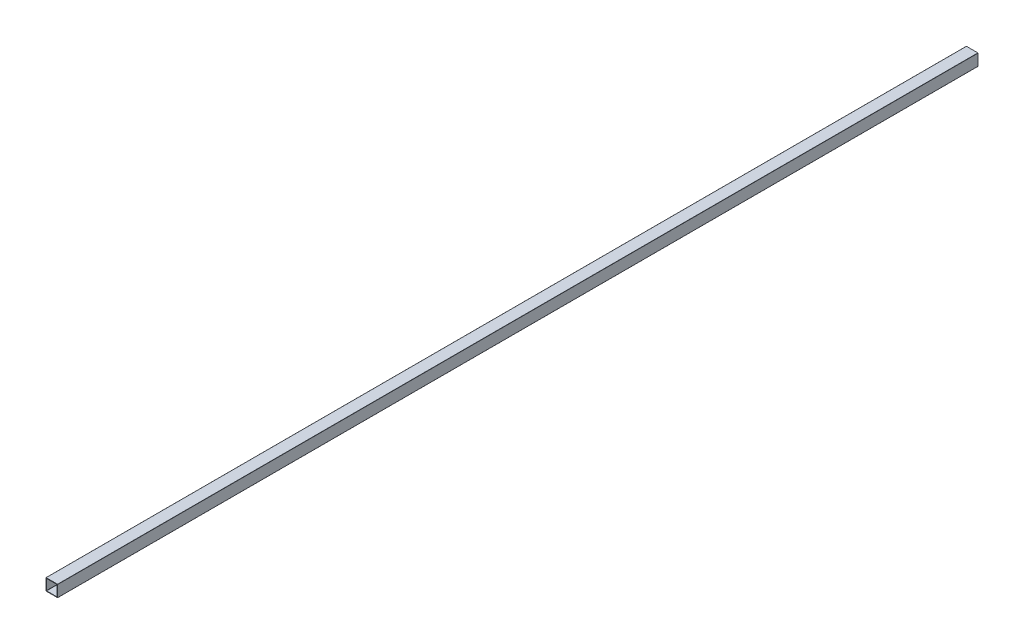
ISO-10303-21;
HEADER;
FILE_DESCRIPTION(('STEP AP214'),'2;1');
FILE_NAME('part.step','',(''),(''),'','','');
FILE_SCHEMA(('AUTOMOTIVE_DESIGN { 1 0 10303 214 1 1 1 1 }'));
ENDSEC;
DATA;
#1=APPLICATION_CONTEXT('core data for automotive mechanical design processes');
#2=APPLICATION_PROTOCOL_DEFINITION('international standard','automotive_design',2000,#1);
#3=PRODUCT_CONTEXT('',#1,'mechanical');
#4=PRODUCT('Part','Part','',(#3));
#5=PRODUCT_RELATED_PRODUCT_CATEGORY('part','',(#4));
#6=PRODUCT_DEFINITION_FORMATION('','',#4);
#7=PRODUCT_DEFINITION_CONTEXT('part definition',#1,'design');
#8=PRODUCT_DEFINITION('design','',#6,#7);
#9=PRODUCT_DEFINITION_SHAPE('','',#8);
#10=(LENGTH_UNIT() NAMED_UNIT(*) SI_UNIT(.MILLI.,.METRE.));
#11=(NAMED_UNIT(*) PLANE_ANGLE_UNIT() SI_UNIT($,.RADIAN.));
#12=(NAMED_UNIT(*) SI_UNIT($,.STERADIAN.) SOLID_ANGLE_UNIT());
#13=UNCERTAINTY_MEASURE_WITH_UNIT(LENGTH_MEASURE(1.E-05),#10,'distance_accuracy_value','');
#14=(GEOMETRIC_REPRESENTATION_CONTEXT(3) GLOBAL_UNCERTAINTY_ASSIGNED_CONTEXT((#13)) GLOBAL_UNIT_ASSIGNED_CONTEXT((#10,
#11,#12)) REPRESENTATION_CONTEXT('',''));
#15=CARTESIAN_POINT('',(0.,0.,0.));
#16=DIRECTION('',(0.,0.,1.));
#17=DIRECTION('',(1.,0.,0.));
#18=AXIS2_PLACEMENT_3D('',#15,#16,#17);
#19=CARTESIAN_POINT('',(38.1,-38.1,-6000.));
#20=DIRECTION('',(1.,0.,0.));
#21=DIRECTION('',(0.,0.,-1.));
#22=AXIS2_PLACEMENT_3D('',#19,#20,#21);
#23=PLANE('',#22);
#24=DIRECTION('',(0.,1.,0.));
#25=VECTOR('',#24,1.);
#26=CARTESIAN_POINT('',(38.1,-38.1,0.));
#27=LINE('',#26,#25);
#28=CARTESIAN_POINT('',(38.1,-37.1,0.));
#29=VERTEX_POINT('',#28);
#30=CARTESIAN_POINT('',(38.1,37.1,0.));
#31=VERTEX_POINT('',#30);
#32=EDGE_CURVE('E197',#29,#31,#27,.T.);
#33=ORIENTED_EDGE('',*,*,#32,.F.);
#34=DIRECTION('',(0.,0.,1.));
#35=VECTOR('',#34,1.);
#36=CARTESIAN_POINT('',(38.1,-37.1,-6000.));
#37=LINE('',#36,#35);
#38=CARTESIAN_POINT('',(38.1,-37.1,-6000.));
#39=VERTEX_POINT('',#38);
#40=EDGE_CURVE('E158',#29,#39,#37,.F.);
#41=ORIENTED_EDGE('',*,*,#40,.T.);
#42=DIRECTION('',(0.,1.,0.));
#43=VECTOR('',#42,1.);
#44=CARTESIAN_POINT('',(38.1,-38.1,-6000.));
#45=LINE('',#44,#43);
#46=CARTESIAN_POINT('',(38.1,37.1,-6000.));
#47=VERTEX_POINT('',#46);
#48=EDGE_CURVE('E185',#39,#47,#45,.T.);
#49=ORIENTED_EDGE('',*,*,#48,.T.);
#50=DIRECTION('',(0.,0.,1.));
#51=VECTOR('',#50,1.);
#52=CARTESIAN_POINT('',(38.1,37.1,-6000.));
#53=LINE('',#52,#51);
#54=EDGE_CURVE('E251',#47,#31,#53,.T.);
#55=ORIENTED_EDGE('',*,*,#54,.T.);
#56=EDGE_LOOP('',(#33,#41,#49,#55));
#57=FACE_BOUND('',#56,.T.);
#58=ADVANCED_FACE('F33',(#57),#23,.T.);
#59=CARTESIAN_POINT('',(-38.1,-38.1,-6000.));
#60=DIRECTION('',(0.,-1.,0.));
#61=DIRECTION('',(0.,0.,-1.));
#62=AXIS2_PLACEMENT_3D('',#59,#60,#61);
#63=PLANE('',#62);
#64=DIRECTION('',(1.,0.,0.));
#65=VECTOR('',#64,1.);
#66=CARTESIAN_POINT('',(-38.1,-38.1,0.));
#67=LINE('',#66,#65);
#68=CARTESIAN_POINT('',(-37.1,-38.1,0.));
#69=VERTEX_POINT('',#68);
#70=CARTESIAN_POINT('',(37.1,-38.1,0.));
#71=VERTEX_POINT('',#70);
#72=EDGE_CURVE('E189',#69,#71,#67,.T.);
#73=ORIENTED_EDGE('',*,*,#72,.F.);
#74=DIRECTION('',(0.,0.,1.));
#75=VECTOR('',#74,1.);
#76=CARTESIAN_POINT('',(-37.1,-38.1,-6000.));
#77=LINE('',#76,#75);
#78=CARTESIAN_POINT('',(-37.1,-38.1,-6000.));
#79=VERTEX_POINT('',#78);
#80=EDGE_CURVE('E238',#69,#79,#77,.F.);
#81=ORIENTED_EDGE('',*,*,#80,.T.);
#82=DIRECTION('',(1.,0.,0.));
#83=VECTOR('',#82,1.);
#84=CARTESIAN_POINT('',(-38.1,-38.1,-6000.));
#85=LINE('',#84,#83);
#86=CARTESIAN_POINT('',(37.1,-38.1,-6000.));
#87=VERTEX_POINT('',#86);
#88=EDGE_CURVE('E194',#79,#87,#85,.T.);
#89=ORIENTED_EDGE('',*,*,#88,.T.);
#90=DIRECTION('',(0.,0.,1.));
#91=VECTOR('',#90,1.);
#92=CARTESIAN_POINT('',(37.1,-38.1,-6000.));
#93=LINE('',#92,#91);
#94=EDGE_CURVE('E235',#87,#71,#93,.T.);
#95=ORIENTED_EDGE('',*,*,#94,.T.);
#96=EDGE_LOOP('',(#73,#81,#89,#95));
#97=FACE_BOUND('',#96,.T.);
#98=ADVANCED_FACE('F305',(#97),#63,.T.);
#99=CARTESIAN_POINT('',(-38.1,-38.1,-6000.));
#100=DIRECTION('',(-1.,0.,0.));
#101=DIRECTION('',(0.,0.,1.));
#102=AXIS2_PLACEMENT_3D('',#99,#100,#101);
#103=PLANE('',#102);
#104=DIRECTION('',(0.,-1.,0.));
#105=VECTOR('',#104,1.);
#106=CARTESIAN_POINT('',(-38.1,-38.1,-6000.));
#107=LINE('',#106,#105);
#108=CARTESIAN_POINT('',(-38.1,37.1,-6000.));
#109=VERTEX_POINT('',#108);
#110=CARTESIAN_POINT('',(-38.1,-37.1,-6000.));
#111=VERTEX_POINT('',#110);
#112=EDGE_CURVE('E191',#109,#111,#107,.T.);
#113=ORIENTED_EDGE('',*,*,#112,.T.);
#114=DIRECTION('',(0.,0.,1.));
#115=VECTOR('',#114,1.);
#116=CARTESIAN_POINT('',(-38.1,-37.1,-6000.));
#117=LINE('',#116,#115);
#118=CARTESIAN_POINT('',(-38.1,-37.1,0.));
#119=VERTEX_POINT('',#118);
#120=EDGE_CURVE('E224',#111,#119,#117,.T.);
#121=ORIENTED_EDGE('',*,*,#120,.T.);
#122=DIRECTION('',(0.,-1.,0.));
#123=VECTOR('',#122,1.);
#124=CARTESIAN_POINT('',(-38.1,-38.1,0.));
#125=LINE('',#124,#123);
#126=CARTESIAN_POINT('',(-38.1,37.1,0.));
#127=VERTEX_POINT('',#126);
#128=EDGE_CURVE('E203',#127,#119,#125,.T.);
#129=ORIENTED_EDGE('',*,*,#128,.F.);
#130=DIRECTION('',(0.,0.,1.));
#131=VECTOR('',#130,1.);
#132=CARTESIAN_POINT('',(-38.1,37.1,-6000.));
#133=LINE('',#132,#131);
#134=EDGE_CURVE('E222',#127,#109,#133,.F.);
#135=ORIENTED_EDGE('',*,*,#134,.T.);
#136=EDGE_LOOP('',(#113,#121,#129,#135));
#137=FACE_BOUND('',#136,.T.);
#138=ADVANCED_FACE('F311',(#137),#103,.T.);
#139=CARTESIAN_POINT('',(-38.1,38.1,-6000.));
#140=DIRECTION('',(0.,1.,0.));
#141=DIRECTION('',(0.,0.,1.));
#142=AXIS2_PLACEMENT_3D('',#139,#140,#141);
#143=PLANE('',#142);
#144=DIRECTION('',(-1.,0.,0.));
#145=VECTOR('',#144,1.);
#146=CARTESIAN_POINT('',(-38.1,38.1,-6000.));
#147=LINE('',#146,#145);
#148=CARTESIAN_POINT('',(37.1,38.1,-6000.));
#149=VERTEX_POINT('',#148);
#150=CARTESIAN_POINT('',(-37.1,38.1,-6000.));
#151=VERTEX_POINT('',#150);
#152=EDGE_CURVE('E188',#149,#151,#147,.T.);
#153=ORIENTED_EDGE('',*,*,#152,.T.);
#154=DIRECTION('',(0.,0.,1.));
#155=VECTOR('',#154,1.);
#156=CARTESIAN_POINT('',(-37.1,38.1,-6000.));
#157=LINE('',#156,#155);
#158=CARTESIAN_POINT('',(-37.1,38.1,0.));
#159=VERTEX_POINT('',#158);
#160=EDGE_CURVE('E248',#151,#159,#157,.T.);
#161=ORIENTED_EDGE('',*,*,#160,.T.);
#162=DIRECTION('',(-1.,0.,0.));
#163=VECTOR('',#162,1.);
#164=CARTESIAN_POINT('',(-38.1,38.1,0.));
#165=LINE('',#164,#163);
#166=CARTESIAN_POINT('',(37.1,38.1,0.));
#167=VERTEX_POINT('',#166);
#168=EDGE_CURVE('E200',#167,#159,#165,.T.);
#169=ORIENTED_EDGE('',*,*,#168,.F.);
#170=DIRECTION('',(0.,0.,1.));
#171=VECTOR('',#170,1.);
#172=CARTESIAN_POINT('',(37.1,38.1,-6000.));
#173=LINE('',#172,#171);
#174=EDGE_CURVE('E55',#167,#149,#173,.F.);
#175=ORIENTED_EDGE('',*,*,#174,.T.);
#176=EDGE_LOOP('',(#153,#161,#169,#175));
#177=FACE_BOUND('',#176,.T.);
#178=ADVANCED_FACE('F316',(#177),#143,.T.);
#179=CARTESIAN_POINT('',(0.,0.,-6000.));
#180=DIRECTION('',(0.,0.,-1.));
#181=DIRECTION('',(-1.,0.,0.));
#182=AXIS2_PLACEMENT_3D('',#179,#180,#181);
#183=PLANE('',#182);
#184=DIRECTION('',(0.,-1.,0.));
#185=VECTOR('',#184,1.);
#186=CARTESIAN_POINT('',(-35.06,-35.06,-6000.));
#187=LINE('',#186,#185);
#188=CARTESIAN_POINT('',(-35.06,34.06,-6000.));
#189=VERTEX_POINT('',#188);
#190=CARTESIAN_POINT('',(-35.06,-34.06,-6000.));
#191=VERTEX_POINT('',#190);
#192=EDGE_CURVE('E167',#189,#191,#187,.T.);
#193=ORIENTED_EDGE('',*,*,#192,.T.);
#194=CARTESIAN_POINT('',(-34.06,-34.06,-6000.));
#195=DIRECTION('',(0.,0.,-1.));
#196=DIRECTION('',(-1.,0.,0.));
#197=AXIS2_PLACEMENT_3D('',#194,#195,#196);
#198=CIRCLE('',#197,1.);
#199=CARTESIAN_POINT('',(-34.06,-35.06,-6000.));
#200=VERTEX_POINT('',#199);
#201=EDGE_CURVE('E11',#191,#200,#198,.F.);
#202=ORIENTED_EDGE('',*,*,#201,.T.);
#203=DIRECTION('',(1.,0.,0.));
#204=VECTOR('',#203,1.);
#205=CARTESIAN_POINT('',(-35.06,-35.06,-6000.));
#206=LINE('',#205,#204);
#207=CARTESIAN_POINT('',(34.06,-35.06,-6000.));
#208=VERTEX_POINT('',#207);
#209=EDGE_CURVE('E175',#200,#208,#206,.T.);
#210=ORIENTED_EDGE('',*,*,#209,.T.);
#211=CARTESIAN_POINT('',(34.06,-34.06,-6000.));
#212=DIRECTION('',(0.,0.,-1.));
#213=DIRECTION('',(-1.,0.,0.));
#214=AXIS2_PLACEMENT_3D('',#211,#212,#213);
#215=CIRCLE('',#214,1.);
#216=CARTESIAN_POINT('',(35.06,-34.06,-6000.));
#217=VERTEX_POINT('',#216);
#218=EDGE_CURVE('E262',#208,#217,#215,.F.);
#219=ORIENTED_EDGE('',*,*,#218,.T.);
#220=DIRECTION('',(0.,1.,0.));
#221=VECTOR('',#220,1.);
#222=CARTESIAN_POINT('',(35.06,-35.06,-6000.));
#223=LINE('',#222,#221);
#224=CARTESIAN_POINT('',(35.06,34.06,-6000.));
#225=VERTEX_POINT('',#224);
#226=EDGE_CURVE('E179',#217,#225,#223,.T.);
#227=ORIENTED_EDGE('',*,*,#226,.T.);
#228=CARTESIAN_POINT('',(34.06,34.06,-6000.));
#229=DIRECTION('',(0.,0.,-1.));
#230=DIRECTION('',(-1.,0.,0.));
#231=AXIS2_PLACEMENT_3D('',#228,#229,#230);
#232=CIRCLE('',#231,1.);
#233=CARTESIAN_POINT('',(34.06,35.06,-6000.));
#234=VERTEX_POINT('',#233);
#235=EDGE_CURVE('E258',#225,#234,#232,.F.);
#236=ORIENTED_EDGE('',*,*,#235,.T.);
#237=DIRECTION('',(-1.,0.,0.));
#238=VECTOR('',#237,1.);
#239=CARTESIAN_POINT('',(-35.06,35.06,-6000.));
#240=LINE('',#239,#238);
#241=CARTESIAN_POINT('',(-34.06,35.06,-6000.));
#242=VERTEX_POINT('',#241);
#243=EDGE_CURVE('E277',#234,#242,#240,.T.);
#244=ORIENTED_EDGE('',*,*,#243,.T.);
#245=CARTESIAN_POINT('',(-34.06,34.06,-6000.));
#246=DIRECTION('',(0.,0.,-1.));
#247=DIRECTION('',(-1.,0.,0.));
#248=AXIS2_PLACEMENT_3D('',#245,#246,#247);
#249=CIRCLE('',#248,1.);
#250=EDGE_CURVE('E157',#242,#189,#249,.F.);
#251=ORIENTED_EDGE('',*,*,#250,.T.);
#252=EDGE_LOOP('',(#193,#202,#210,#219,#227,#236,#244,#251));
#253=FACE_BOUND('',#252,.T.);
#254=ORIENTED_EDGE('',*,*,#88,.F.);
#255=CARTESIAN_POINT('',(-37.1,-37.1,-6000.));
#256=DIRECTION('',(0.,0.,-1.));
#257=DIRECTION('',(-1.,0.,0.));
#258=AXIS2_PLACEMENT_3D('',#255,#256,#257);
#259=CIRCLE('',#258,1.);
#260=EDGE_CURVE('E245',#79,#111,#259,.T.);
#261=ORIENTED_EDGE('',*,*,#260,.T.);
#262=ORIENTED_EDGE('',*,*,#112,.F.);
#263=CARTESIAN_POINT('',(-37.1,37.1,-6000.));
#264=DIRECTION('',(0.,0.,-1.));
#265=DIRECTION('',(-1.,0.,0.));
#266=AXIS2_PLACEMENT_3D('',#263,#264,#265);
#267=CIRCLE('',#266,1.);
#268=EDGE_CURVE('E48',#109,#151,#267,.T.);
#269=ORIENTED_EDGE('',*,*,#268,.T.);
#270=ORIENTED_EDGE('',*,*,#152,.F.);
#271=CARTESIAN_POINT('',(37.1,37.1,-6000.));
#272=DIRECTION('',(0.,0.,-1.));
#273=DIRECTION('',(-1.,0.,0.));
#274=AXIS2_PLACEMENT_3D('',#271,#272,#273);
#275=CIRCLE('',#274,1.);
#276=EDGE_CURVE('E240',#149,#47,#275,.T.);
#277=ORIENTED_EDGE('',*,*,#276,.T.);
#278=ORIENTED_EDGE('',*,*,#48,.F.);
#279=CARTESIAN_POINT('',(37.1,-37.1,-6000.));
#280=DIRECTION('',(0.,0.,-1.));
#281=DIRECTION('',(-1.,0.,0.));
#282=AXIS2_PLACEMENT_3D('',#279,#280,#281);
#283=CIRCLE('',#282,1.);
#284=EDGE_CURVE('E242',#39,#87,#283,.T.);
#285=ORIENTED_EDGE('',*,*,#284,.T.);
#286=EDGE_LOOP('',(#254,#261,#262,#269,#270,#277,#278,#285));
#287=FACE_BOUND('',#286,.T.);
#288=ADVANCED_FACE('F267',(#253,#287),#183,.T.);
#289=CARTESIAN_POINT('',(0.,0.,0.));
#290=DIRECTION('',(0.,0.,-1.));
#291=DIRECTION('',(-1.,0.,0.));
#292=AXIS2_PLACEMENT_3D('',#289,#290,#291);
#293=PLANE('',#292);
#294=DIRECTION('',(0.,1.,0.));
#295=VECTOR('',#294,1.);
#296=CARTESIAN_POINT('',(35.06,-35.06,0.));
#297=LINE('',#296,#295);
#298=CARTESIAN_POINT('',(35.06,-34.06,0.));
#299=VERTEX_POINT('',#298);
#300=CARTESIAN_POINT('',(35.06,34.06,0.));
#301=VERTEX_POINT('',#300);
#302=EDGE_CURVE('E181',#299,#301,#297,.T.);
#303=ORIENTED_EDGE('',*,*,#302,.F.);
#304=CARTESIAN_POINT('',(34.06,-34.06,0.));
#305=DIRECTION('',(0.,0.,-1.));
#306=DIRECTION('',(-1.,0.,0.));
#307=AXIS2_PLACEMENT_3D('',#304,#305,#306);
#308=CIRCLE('',#307,1.);
#309=CARTESIAN_POINT('',(34.06,-35.06,0.));
#310=VERTEX_POINT('',#309);
#311=EDGE_CURVE('E260',#299,#310,#308,.T.);
#312=ORIENTED_EDGE('',*,*,#311,.T.);
#313=DIRECTION('',(1.,0.,0.));
#314=VECTOR('',#313,1.);
#315=CARTESIAN_POINT('',(-35.06,-35.06,0.));
#316=LINE('',#315,#314);
#317=CARTESIAN_POINT('',(-34.06,-35.06,0.));
#318=VERTEX_POINT('',#317);
#319=EDGE_CURVE('E281',#318,#310,#316,.T.);
#320=ORIENTED_EDGE('',*,*,#319,.F.);
#321=CARTESIAN_POINT('',(-34.06,-34.06,0.));
#322=DIRECTION('',(0.,0.,-1.));
#323=DIRECTION('',(-1.,0.,0.));
#324=AXIS2_PLACEMENT_3D('',#321,#322,#323);
#325=CIRCLE('',#324,1.);
#326=CARTESIAN_POINT('',(-35.06,-34.06,0.));
#327=VERTEX_POINT('',#326);
#328=EDGE_CURVE('E41',#318,#327,#325,.T.);
#329=ORIENTED_EDGE('',*,*,#328,.T.);
#330=DIRECTION('',(0.,-1.,0.));
#331=VECTOR('',#330,1.);
#332=CARTESIAN_POINT('',(-35.06,-35.06,0.));
#333=LINE('',#332,#331);
#334=CARTESIAN_POINT('',(-35.06,34.06,0.));
#335=VERTEX_POINT('',#334);
#336=EDGE_CURVE('E164',#335,#327,#333,.T.);
#337=ORIENTED_EDGE('',*,*,#336,.F.);
#338=CARTESIAN_POINT('',(-34.06,34.06,0.));
#339=DIRECTION('',(0.,0.,-1.));
#340=DIRECTION('',(-1.,0.,0.));
#341=AXIS2_PLACEMENT_3D('',#338,#339,#340);
#342=CIRCLE('',#341,1.);
#343=CARTESIAN_POINT('',(-34.06,35.06,0.));
#344=VERTEX_POINT('',#343);
#345=EDGE_CURVE('E147',#335,#344,#342,.T.);
#346=ORIENTED_EDGE('',*,*,#345,.T.);
#347=DIRECTION('',(-1.,0.,0.));
#348=VECTOR('',#347,1.);
#349=CARTESIAN_POINT('',(-35.06,35.06,0.));
#350=LINE('',#349,#348);
#351=CARTESIAN_POINT('',(34.06,35.06,0.));
#352=VERTEX_POINT('',#351);
#353=EDGE_CURVE('E176',#352,#344,#350,.T.);
#354=ORIENTED_EDGE('',*,*,#353,.F.);
#355=CARTESIAN_POINT('',(34.06,34.06,0.));
#356=DIRECTION('',(0.,0.,-1.));
#357=DIRECTION('',(-1.,0.,0.));
#358=AXIS2_PLACEMENT_3D('',#355,#356,#357);
#359=CIRCLE('',#358,1.);
#360=EDGE_CURVE('E256',#352,#301,#359,.T.);
#361=ORIENTED_EDGE('',*,*,#360,.T.);
#362=EDGE_LOOP('',(#303,#312,#320,#329,#337,#346,#354,#361));
#363=FACE_BOUND('',#362,.T.);
#364=ORIENTED_EDGE('',*,*,#128,.T.);
#365=CARTESIAN_POINT('',(-37.1,-37.1,0.));
#366=DIRECTION('',(0.,0.,-1.));
#367=DIRECTION('',(-1.,0.,0.));
#368=AXIS2_PLACEMENT_3D('',#365,#366,#367);
#369=CIRCLE('',#368,1.);
#370=EDGE_CURVE('E233',#119,#69,#369,.F.);
#371=ORIENTED_EDGE('',*,*,#370,.T.);
#372=ORIENTED_EDGE('',*,*,#72,.T.);
#373=CARTESIAN_POINT('',(37.1,-37.1,0.));
#374=DIRECTION('',(0.,0.,-1.));
#375=DIRECTION('',(-1.,0.,0.));
#376=AXIS2_PLACEMENT_3D('',#373,#374,#375);
#377=CIRCLE('',#376,1.);
#378=EDGE_CURVE('E229',#71,#29,#377,.F.);
#379=ORIENTED_EDGE('',*,*,#378,.T.);
#380=ORIENTED_EDGE('',*,*,#32,.T.);
#381=CARTESIAN_POINT('',(37.1,37.1,0.));
#382=DIRECTION('',(0.,0.,-1.));
#383=DIRECTION('',(-1.,0.,0.));
#384=AXIS2_PLACEMENT_3D('',#381,#382,#383);
#385=CIRCLE('',#384,1.);
#386=EDGE_CURVE('E227',#31,#167,#385,.F.);
#387=ORIENTED_EDGE('',*,*,#386,.T.);
#388=ORIENTED_EDGE('',*,*,#168,.T.);
#389=CARTESIAN_POINT('',(-37.1,37.1,0.));
#390=DIRECTION('',(0.,0.,-1.));
#391=DIRECTION('',(-1.,0.,0.));
#392=AXIS2_PLACEMENT_3D('',#389,#390,#391);
#393=CIRCLE('',#392,1.);
#394=EDGE_CURVE('E231',#159,#127,#393,.F.);
#395=ORIENTED_EDGE('',*,*,#394,.T.);
#396=EDGE_LOOP('',(#364,#371,#372,#379,#380,#387,#388,#395));
#397=FACE_BOUND('',#396,.T.);
#398=ADVANCED_FACE('F172',(#363,#397),#293,.F.);
#399=CARTESIAN_POINT('',(-35.06,-35.06,-6000.));
#400=DIRECTION('',(0.,-1.,0.));
#401=DIRECTION('',(0.,0.,-1.));
#402=AXIS2_PLACEMENT_3D('',#399,#400,#401);
#403=PLANE('',#402);
#404=ORIENTED_EDGE('',*,*,#319,.T.);
#405=DIRECTION('',(0.,0.,1.));
#406=VECTOR('',#405,1.);
#407=CARTESIAN_POINT('',(34.06,-35.06,-6000.));
#408=LINE('',#407,#406);
#409=EDGE_CURVE('E220',#310,#208,#408,.F.);
#410=ORIENTED_EDGE('',*,*,#409,.T.);
#411=ORIENTED_EDGE('',*,*,#209,.F.);
#412=DIRECTION('',(0.,0.,1.));
#413=VECTOR('',#412,1.);
#414=CARTESIAN_POINT('',(-34.06,-35.06,0.));
#415=LINE('',#414,#413);
#416=EDGE_CURVE('E217',#200,#318,#415,.T.);
#417=ORIENTED_EDGE('',*,*,#416,.T.);
#418=EDGE_LOOP('',(#404,#410,#411,#417));
#419=FACE_BOUND('',#418,.T.);
#420=ADVANCED_FACE('F283',(#419),#403,.F.);
#421=CARTESIAN_POINT('',(-35.06,-35.06,-6000.));
#422=DIRECTION('',(-1.,0.,0.));
#423=DIRECTION('',(0.,0.,1.));
#424=AXIS2_PLACEMENT_3D('',#421,#422,#423);
#425=PLANE('',#424);
#426=ORIENTED_EDGE('',*,*,#192,.F.);
#427=DIRECTION('',(0.,0.,1.));
#428=VECTOR('',#427,1.);
#429=CARTESIAN_POINT('',(-35.06,34.06,0.));
#430=LINE('',#429,#428);
#431=EDGE_CURVE('E151',#189,#335,#430,.T.);
#432=ORIENTED_EDGE('',*,*,#431,.T.);
#433=ORIENTED_EDGE('',*,*,#336,.T.);
#434=DIRECTION('',(0.,0.,1.));
#435=VECTOR('',#434,1.);
#436=CARTESIAN_POINT('',(-35.06,-34.06,-6000.));
#437=LINE('',#436,#435);
#438=EDGE_CURVE('E169',#327,#191,#437,.F.);
#439=ORIENTED_EDGE('',*,*,#438,.T.);
#440=EDGE_LOOP('',(#426,#432,#433,#439));
#441=FACE_BOUND('',#440,.T.);
#442=ADVANCED_FACE('F163',(#441),#425,.F.);
#443=CARTESIAN_POINT('',(-35.06,35.06,-6000.));
#444=DIRECTION('',(0.,1.,0.));
#445=DIRECTION('',(-1.,0.,0.));
#446=AXIS2_PLACEMENT_3D('',#443,#444,#445);
#447=PLANE('',#446);
#448=ORIENTED_EDGE('',*,*,#353,.T.);
#449=DIRECTION('',(0.,0.,1.));
#450=VECTOR('',#449,1.);
#451=CARTESIAN_POINT('',(-34.06,35.06,-6000.));
#452=LINE('',#451,#450);
#453=EDGE_CURVE('E152',#344,#242,#452,.F.);
#454=ORIENTED_EDGE('',*,*,#453,.T.);
#455=ORIENTED_EDGE('',*,*,#243,.F.);
#456=DIRECTION('',(0.,0.,1.));
#457=VECTOR('',#456,1.);
#458=CARTESIAN_POINT('',(34.06,35.06,0.));
#459=LINE('',#458,#457);
#460=EDGE_CURVE('E168',#234,#352,#459,.T.);
#461=ORIENTED_EDGE('',*,*,#460,.T.);
#462=EDGE_LOOP('',(#448,#454,#455,#461));
#463=FACE_BOUND('',#462,.T.);
#464=ADVANCED_FACE('F292',(#463),#447,.F.);
#465=CARTESIAN_POINT('',(35.06,-35.06,-6000.));
#466=DIRECTION('',(1.,0.,0.));
#467=DIRECTION('',(0.,1.,0.));
#468=AXIS2_PLACEMENT_3D('',#465,#466,#467);
#469=PLANE('',#468);
#470=ORIENTED_EDGE('',*,*,#302,.T.);
#471=DIRECTION('',(0.,0.,1.));
#472=VECTOR('',#471,1.);
#473=CARTESIAN_POINT('',(35.06,34.06,-6000.));
#474=LINE('',#473,#472);
#475=EDGE_CURVE('E215',#301,#225,#474,.F.);
#476=ORIENTED_EDGE('',*,*,#475,.T.);
#477=ORIENTED_EDGE('',*,*,#226,.F.);
#478=DIRECTION('',(0.,0.,1.));
#479=VECTOR('',#478,1.);
#480=CARTESIAN_POINT('',(35.06,-34.06,0.));
#481=LINE('',#480,#479);
#482=EDGE_CURVE('E212',#217,#299,#481,.T.);
#483=ORIENTED_EDGE('',*,*,#482,.T.);
#484=EDGE_LOOP('',(#470,#476,#477,#483));
#485=FACE_BOUND('',#484,.T.);
#486=ADVANCED_FACE('F275',(#485),#469,.F.);
#487=CARTESIAN_POINT('',(-34.06,34.06,-6000.));
#488=DIRECTION('',(0.,0.,-1.));
#489=DIRECTION('',(-1.,0.,0.));
#490=AXIS2_PLACEMENT_3D('',#487,#488,#489);
#491=CYLINDRICAL_SURFACE('',#490,1.);
#492=ORIENTED_EDGE('',*,*,#250,.F.);
#493=ORIENTED_EDGE('',*,*,#453,.F.);
#494=ORIENTED_EDGE('',*,*,#345,.F.);
#495=ORIENTED_EDGE('',*,*,#431,.F.);
#496=EDGE_LOOP('',(#492,#493,#494,#495));
#497=FACE_BOUND('',#496,.T.);
#498=ADVANCED_FACE('F150',(#497),#491,.F.);
#499=CARTESIAN_POINT('',(34.06,34.06,-6000.));
#500=DIRECTION('',(0.,0.,-1.));
#501=DIRECTION('',(-1.,0.,0.));
#502=AXIS2_PLACEMENT_3D('',#499,#500,#501);
#503=CYLINDRICAL_SURFACE('',#502,1.);
#504=ORIENTED_EDGE('',*,*,#235,.F.);
#505=ORIENTED_EDGE('',*,*,#475,.F.);
#506=ORIENTED_EDGE('',*,*,#360,.F.);
#507=ORIENTED_EDGE('',*,*,#460,.F.);
#508=EDGE_LOOP('',(#504,#505,#506,#507));
#509=FACE_BOUND('',#508,.T.);
#510=ADVANCED_FACE('F294',(#509),#503,.F.);
#511=CARTESIAN_POINT('',(34.06,-34.06,-6000.));
#512=DIRECTION('',(0.,0.,-1.));
#513=DIRECTION('',(-1.,0.,0.));
#514=AXIS2_PLACEMENT_3D('',#511,#512,#513);
#515=CYLINDRICAL_SURFACE('',#514,1.);
#516=ORIENTED_EDGE('',*,*,#218,.F.);
#517=ORIENTED_EDGE('',*,*,#409,.F.);
#518=ORIENTED_EDGE('',*,*,#311,.F.);
#519=ORIENTED_EDGE('',*,*,#482,.F.);
#520=EDGE_LOOP('',(#516,#517,#518,#519));
#521=FACE_BOUND('',#520,.T.);
#522=ADVANCED_FACE('F279',(#521),#515,.F.);
#523=CARTESIAN_POINT('',(-37.1,-37.1,-6000.));
#524=DIRECTION('',(0.,0.,1.));
#525=DIRECTION('',(1.,0.,0.));
#526=AXIS2_PLACEMENT_3D('',#523,#524,#525);
#527=CYLINDRICAL_SURFACE('',#526,1.);
#528=ORIENTED_EDGE('',*,*,#260,.F.);
#529=ORIENTED_EDGE('',*,*,#80,.F.);
#530=ORIENTED_EDGE('',*,*,#370,.F.);
#531=ORIENTED_EDGE('',*,*,#120,.F.);
#532=EDGE_LOOP('',(#528,#529,#530,#531));
#533=FACE_BOUND('',#532,.T.);
#534=ADVANCED_FACE('F301',(#533),#527,.T.);
#535=CARTESIAN_POINT('',(-37.1,37.1,-6000.));
#536=DIRECTION('',(0.,0.,1.));
#537=DIRECTION('',(1.,0.,0.));
#538=AXIS2_PLACEMENT_3D('',#535,#536,#537);
#539=CYLINDRICAL_SURFACE('',#538,1.);
#540=ORIENTED_EDGE('',*,*,#268,.F.);
#541=ORIENTED_EDGE('',*,*,#134,.F.);
#542=ORIENTED_EDGE('',*,*,#394,.F.);
#543=ORIENTED_EDGE('',*,*,#160,.F.);
#544=EDGE_LOOP('',(#540,#541,#542,#543));
#545=FACE_BOUND('',#544,.T.);
#546=ADVANCED_FACE('F368',(#545),#539,.T.);
#547=CARTESIAN_POINT('',(-34.06,-34.06,-6000.));
#548=DIRECTION('',(0.,0.,-1.));
#549=DIRECTION('',(-1.,0.,0.));
#550=AXIS2_PLACEMENT_3D('',#547,#548,#549);
#551=CYLINDRICAL_SURFACE('',#550,1.);
#552=ORIENTED_EDGE('',*,*,#201,.F.);
#553=ORIENTED_EDGE('',*,*,#438,.F.);
#554=ORIENTED_EDGE('',*,*,#328,.F.);
#555=ORIENTED_EDGE('',*,*,#416,.F.);
#556=EDGE_LOOP('',(#552,#553,#554,#555));
#557=FACE_BOUND('',#556,.T.);
#558=ADVANCED_FACE('F378',(#557),#551,.F.);
#559=CARTESIAN_POINT('',(37.1,-37.1,-6000.));
#560=DIRECTION('',(0.,0.,1.));
#561=DIRECTION('',(1.,0.,0.));
#562=AXIS2_PLACEMENT_3D('',#559,#560,#561);
#563=CYLINDRICAL_SURFACE('',#562,1.);
#564=ORIENTED_EDGE('',*,*,#284,.F.);
#565=ORIENTED_EDGE('',*,*,#40,.F.);
#566=ORIENTED_EDGE('',*,*,#378,.F.);
#567=ORIENTED_EDGE('',*,*,#94,.F.);
#568=EDGE_LOOP('',(#564,#565,#566,#567));
#569=FACE_BOUND('',#568,.T.);
#570=ADVANCED_FACE('F388',(#569),#563,.T.);
#571=CARTESIAN_POINT('',(37.1,37.1,-6000.));
#572=DIRECTION('',(0.,0.,1.));
#573=DIRECTION('',(1.,0.,0.));
#574=AXIS2_PLACEMENT_3D('',#571,#572,#573);
#575=CYLINDRICAL_SURFACE('',#574,1.);
#576=ORIENTED_EDGE('',*,*,#276,.F.);
#577=ORIENTED_EDGE('',*,*,#174,.F.);
#578=ORIENTED_EDGE('',*,*,#386,.F.);
#579=ORIENTED_EDGE('',*,*,#54,.F.);
#580=EDGE_LOOP('',(#576,#577,#578,#579));
#581=FACE_BOUND('',#580,.T.);
#582=ADVANCED_FACE('F35',(#581),#575,.T.);
#583=CLOSED_SHELL('',(#58,#98,#138,#178,#288,#398,#420,#442,#464,#486,#498,#510,#522,#534,#546,
#558,#570,#582));
#584=MANIFOLD_SOLID_BREP('B2',#583);
#585=ADVANCED_BREP_SHAPE_REPRESENTATION('',(#18,#584),#14);
#586=SHAPE_DEFINITION_REPRESENTATION(#9,#585);
ENDSEC;
END-ISO-10303-21;
